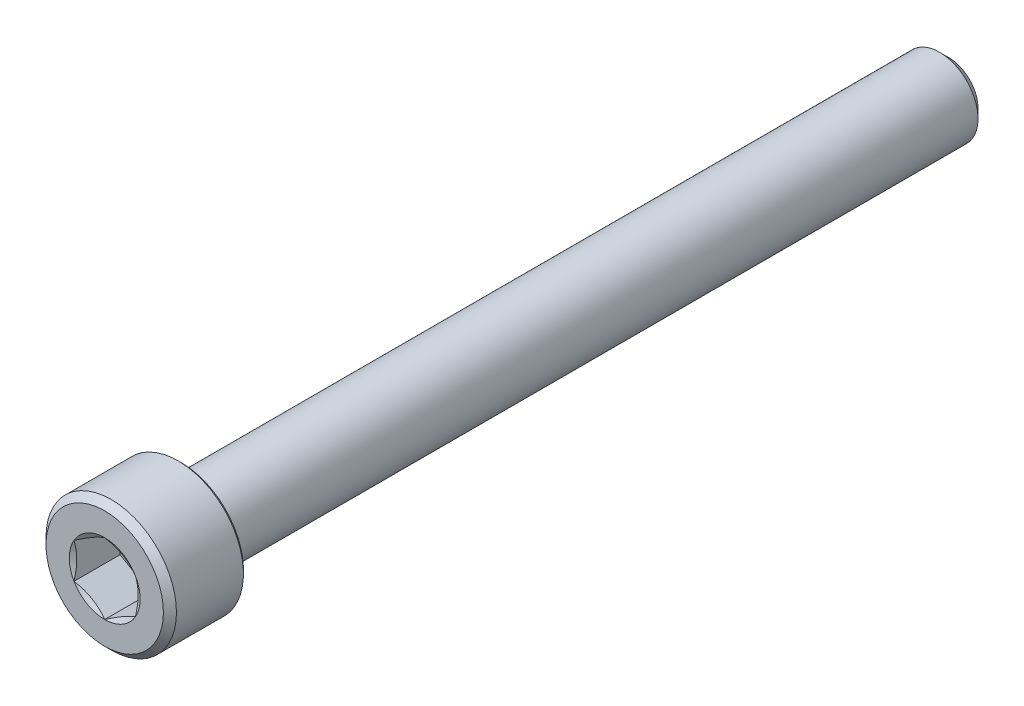
ISO-10303-21;
HEADER;
FILE_DESCRIPTION(('STEP AP214'),'2;1');
FILE_NAME('part.step','',(''),(''),'','','');
FILE_SCHEMA(('AUTOMOTIVE_DESIGN { 1 0 10303 214 1 1 1 1 }'));
ENDSEC;
DATA;
#1=APPLICATION_CONTEXT('core data for automotive mechanical design processes');
#2=APPLICATION_PROTOCOL_DEFINITION('international standard','automotive_design',2000,#1);
#3=PRODUCT_CONTEXT('',#1,'mechanical');
#4=PRODUCT('Part','Part','',(#3));
#5=PRODUCT_RELATED_PRODUCT_CATEGORY('part','',(#4));
#6=PRODUCT_DEFINITION_FORMATION('','',#4);
#7=PRODUCT_DEFINITION_CONTEXT('part definition',#1,'design');
#8=PRODUCT_DEFINITION('design','',#6,#7);
#9=PRODUCT_DEFINITION_SHAPE('','',#8);
#10=(LENGTH_UNIT() NAMED_UNIT(*) SI_UNIT(.MILLI.,.METRE.));
#11=(NAMED_UNIT(*) PLANE_ANGLE_UNIT() SI_UNIT($,.RADIAN.));
#12=(NAMED_UNIT(*) SI_UNIT($,.STERADIAN.) SOLID_ANGLE_UNIT());
#13=UNCERTAINTY_MEASURE_WITH_UNIT(LENGTH_MEASURE(1.E-05),#10,'distance_accuracy_value','');
#14=(GEOMETRIC_REPRESENTATION_CONTEXT(3) GLOBAL_UNCERTAINTY_ASSIGNED_CONTEXT((#13)) GLOBAL_UNIT_ASSIGNED_CONTEXT((#10,
#11,#12)) REPRESENTATION_CONTEXT('',''));
#15=CARTESIAN_POINT('',(0.,0.,0.));
#16=DIRECTION('',(0.,0.,1.));
#17=DIRECTION('',(1.,0.,0.));
#18=AXIS2_PLACEMENT_3D('',#15,#16,#17);
#19=CARTESIAN_POINT('',(-4.03749999999999,0.,22.5));
#20=DIRECTION('',(0.,0.,-1.));
#21=DIRECTION('',(-1.,0.,0.));
#22=AXIS2_PLACEMENT_3D('',#19,#20,#21);
#23=PLANE('',#22);
#24=CARTESIAN_POINT('',(0.,0.,22.5));
#25=DIRECTION('',(0.,0.,-1.));
#26=DIRECTION('',(-1.,0.,0.));
#27=AXIS2_PLACEMENT_3D('',#24,#25,#26);
#28=CIRCLE('',#27,2.5);
#29=CARTESIAN_POINT('',(-2.5,0.,22.5));
#30=VERTEX_POINT('',#29);
#31=EDGE_CURVE('E12',#30,#30,#28,.T.);
#32=ORIENTED_EDGE('',*,*,#31,.F.);
#33=EDGE_LOOP('',(#32));
#34=FACE_BOUND('',#33,.T.);
#35=CARTESIAN_POINT('',(0.,0.,22.5));
#36=DIRECTION('',(0.,0.,-1.));
#37=DIRECTION('',(-1.,0.,0.));
#38=AXIS2_PLACEMENT_3D('',#35,#36,#37);
#39=CIRCLE('',#38,4.03749999999999);
#40=CARTESIAN_POINT('',(-4.03749999999999,0.,22.5));
#41=VERTEX_POINT('',#40);
#42=EDGE_CURVE('E260',#41,#41,#39,.T.);
#43=ORIENTED_EDGE('',*,*,#42,.T.);
#44=EDGE_LOOP('',(#43));
#45=FACE_BOUND('',#44,.T.);
#46=ADVANCED_FACE('F42',(#34,#45),#23,.T.);
#47=CARTESIAN_POINT('',(0.,0.,24.5));
#48=DIRECTION('',(0.,0.,1.));
#49=DIRECTION('',(1.,0.,0.));
#50=AXIS2_PLACEMENT_3D('',#47,#48,#49);
#51=PLANE('',#50);
#52=DIRECTION('',(-0.866025403784439,0.5,0.));
#53=VECTOR('',#52,1.);
#54=CARTESIAN_POINT('',(2.,1.15470053837925,24.5));
#55=LINE('',#54,#53);
#56=CARTESIAN_POINT('',(2.,1.15470053837925,24.5));
#57=VERTEX_POINT('',#56);
#58=CARTESIAN_POINT('',(0.,2.3094010767585,24.5));
#59=VERTEX_POINT('',#58);
#60=EDGE_CURVE('E108',#57,#59,#55,.T.);
#61=ORIENTED_EDGE('',*,*,#60,.T.);
#62=DIRECTION('',(-0.866025403784438,-0.5,0.));
#63=VECTOR('',#62,1.);
#64=CARTESIAN_POINT('',(0.,2.3094010767585,24.5));
#65=LINE('',#64,#63);
#66=CARTESIAN_POINT('',(-2.,1.15470053837925,24.5));
#67=VERTEX_POINT('',#66);
#68=EDGE_CURVE('E227',#59,#67,#65,.T.);
#69=ORIENTED_EDGE('',*,*,#68,.T.);
#70=DIRECTION('',(0.,-1.,0.));
#71=VECTOR('',#70,1.);
#72=CARTESIAN_POINT('',(-2.,1.15470053837925,24.5));
#73=LINE('',#72,#71);
#74=CARTESIAN_POINT('',(-2.,-1.15470053837925,24.5));
#75=VERTEX_POINT('',#74);
#76=EDGE_CURVE('E230',#67,#75,#73,.T.);
#77=ORIENTED_EDGE('',*,*,#76,.T.);
#78=DIRECTION('',(0.866025403784439,-0.5,0.));
#79=VECTOR('',#78,1.);
#80=CARTESIAN_POINT('',(-2.,-1.15470053837925,24.5));
#81=LINE('',#80,#79);
#82=CARTESIAN_POINT('',(0.,-2.3094010767585,24.5));
#83=VERTEX_POINT('',#82);
#84=EDGE_CURVE('E231',#75,#83,#81,.T.);
#85=ORIENTED_EDGE('',*,*,#84,.T.);
#86=DIRECTION('',(0.866025403784439,0.5,0.));
#87=VECTOR('',#86,1.);
#88=CARTESIAN_POINT('',(0.,-2.3094010767585,24.5));
#89=LINE('',#88,#87);
#90=CARTESIAN_POINT('',(2.,-1.15470053837925,24.5));
#91=VERTEX_POINT('',#90);
#92=EDGE_CURVE('E236',#83,#91,#89,.T.);
#93=ORIENTED_EDGE('',*,*,#92,.T.);
#94=DIRECTION('',(0.,1.,0.));
#95=VECTOR('',#94,1.);
#96=CARTESIAN_POINT('',(2.,-1.15470053837925,24.5));
#97=LINE('',#96,#95);
#98=EDGE_CURVE('E229',#91,#57,#97,.T.);
#99=ORIENTED_EDGE('',*,*,#98,.T.);
#100=EDGE_LOOP('',(#61,#69,#77,#85,#93,#99));
#101=FACE_BOUND('',#100,.T.);
#102=ADVANCED_FACE('F216',(#101),#51,.T.);
#103=CARTESIAN_POINT('',(0.,2.3094010767585,24.5));
#104=DIRECTION('',(-0.5,0.866025403784439,0.));
#105=DIRECTION('',(-0.866025403784439,-0.5,0.));
#106=AXIS2_PLACEMENT_3D('',#103,#104,#105);
#107=PLANE('',#106);
#108=DIRECTION('',(0.,0.,1.));
#109=VECTOR('',#108,1.);
#110=CARTESIAN_POINT('',(0.,2.3094010767585,24.5));
#111=LINE('',#110,#109);
#112=CARTESIAN_POINT('',(0.,2.3094010767585,27.5));
#113=VERTEX_POINT('',#112);
#114=EDGE_CURVE('E64',#59,#113,#111,.T.);
#115=ORIENTED_EDGE('',*,*,#114,.T.);
#116=CARTESIAN_POINT('',(0.000199999999999582,2.30951654681234,27.5000666716664));
#117=CARTESIAN_POINT('',(-0.0876912629000604,2.25877250251757,27.4707567411466));
#118=CARTESIAN_POINT('',(-0.176341194473592,2.20759044065995,27.4441000570264));
#119=CARTESIAN_POINT('',(-0.355176246997803,2.10433997494456,27.3975696960666));
#120=CARTESIAN_POINT('',(-0.445364546505037,2.0522697359463,27.3777124814287));
#121=CARTESIAN_POINT('',(-0.624623385763307,1.94877459684592,27.3468006690692));
#122=CARTESIAN_POINT('',(-0.713666338226305,1.89736562427197,27.3355403566444));
#123=CARTESIAN_POINT('',(-0.892171397785044,1.79430568008402,27.3220958676406));
#124=CARTESIAN_POINT('',(-0.981632855703959,1.74265508327244,27.3199005599994));
#125=CARTESIAN_POINT('',(-1.1488083535488,1.64613626458981,27.3244581943766));
#126=CARTESIAN_POINT('',(-1.22654737026578,1.60125362236172,27.3300920797329));
#127=CARTESIAN_POINT('',(-1.38151891453613,1.51178075956051,27.3479511003067));
#128=CARTESIAN_POINT('',(-1.4587509057412,1.46719084864821,27.3601823410694));
#129=CARTESIAN_POINT('',(-1.6140421864822,1.37753338590959,27.3907606419135));
#130=CARTESIAN_POINT('',(-1.69208181310738,1.33247718647009,27.4092373721116));
#131=CARTESIAN_POINT('',(-1.84699686569213,1.24303693915875,27.4511727232588));
#132=CARTESIAN_POINT('',(-1.92387427762312,1.1986517446858,27.4746214855382));
#133=CARTESIAN_POINT('',(-2.0002,1.15458506832541,27.5000666716664));
#134=B_SPLINE_CURVE_WITH_KNOTS('',3,(#116,#117,#118,#119,#120,#121,#122,#123,#124,#125,#126,
#127,#128,#129,#130,#131,#132,#133),.UNSPECIFIED.,.F.,.F.,(4,2,2,2,2,2,2,2,4),(0.,
0.31703182469561,0.634825876346564,0.944753967652636,1.25430138000371,1.52387047293094,
1.79368946861028,2.06949491027634,2.34475850821472),.UNSPECIFIED.);
#135=CARTESIAN_POINT('',(-2.,1.15470053837925,27.5));
#136=VERTEX_POINT('',#135);
#137=EDGE_CURVE('E121',#113,#136,#134,.T.);
#138=ORIENTED_EDGE('',*,*,#137,.T.);
#139=DIRECTION('',(0.,0.,1.));
#140=VECTOR('',#139,1.);
#141=CARTESIAN_POINT('',(-2.,1.15470053837925,24.5));
#142=LINE('',#141,#140);
#143=EDGE_CURVE('E245',#67,#136,#142,.T.);
#144=ORIENTED_EDGE('',*,*,#143,.F.);
#145=ORIENTED_EDGE('',*,*,#68,.F.);
#146=EDGE_LOOP('',(#115,#138,#144,#145));
#147=FACE_BOUND('',#146,.T.);
#148=ADVANCED_FACE('F155',(#147),#107,.F.);
#149=CARTESIAN_POINT('',(-2.,1.15470053837925,24.5));
#150=DIRECTION('',(-1.,0.,0.));
#151=DIRECTION('',(0.,-1.,0.));
#152=AXIS2_PLACEMENT_3D('',#149,#150,#151);
#153=PLANE('',#152);
#154=ORIENTED_EDGE('',*,*,#143,.T.);
#155=CARTESIAN_POINT('',(-2.,-2.99029024286746,28.2436705774789));
#156=CARTESIAN_POINT('',(-2.,-2.9039233549122,28.2022350128154));
#157=CARTESIAN_POINT('',(-2.,-2.81734606544375,28.1612298310159));
#158=CARTESIAN_POINT('',(-2.,-2.64365854493735,28.0803243821909));
#159=CARTESIAN_POINT('',(-2.,-2.55654822138744,28.0404243140125));
#160=CARTESIAN_POINT('',(-2.,-2.38118302896117,27.9617503389694));
#161=CARTESIAN_POINT('',(-2.,-2.29292442261223,27.9229847316336));
#162=CARTESIAN_POINT('',(-2.,-2.11566660170982,27.8471918635543));
#163=CARTESIAN_POINT('',(-2.,-2.02666742594867,27.8101645124244));
#164=CARTESIAN_POINT('',(-2.,-1.84544249851511,27.7373681681925));
#165=CARTESIAN_POINT('',(-2.,-1.75319322532995,27.701657387434));
#166=CARTESIAN_POINT('',(-2.,-1.56757885700113,27.6332048464352));
#167=CARTESIAN_POINT('',(-2.,-1.4742136338563,27.6004634305571));
#168=CARTESIAN_POINT('',(-2.,-1.28643446361951,27.5388859327172));
#169=CARTESIAN_POINT('',(-2.,-1.19202351048257,27.5100408191443));
#170=CARTESIAN_POINT('',(-2.,-1.00184859453872,27.4572423245237));
#171=CARTESIAN_POINT('',(-2.,-0.906084974095545,27.4332877285792));
#172=CARTESIAN_POINT('',(-2.,-0.713403981060255,27.3915474538638));
#173=CARTESIAN_POINT('',(-2.,-0.616489407871837,27.3737491049484));
#174=CARTESIAN_POINT('',(-2.,-0.421576659767191,27.3454859555612));
#175=CARTESIAN_POINT('',(-2.,-0.323578558532563,27.3350206595082));
#176=CARTESIAN_POINT('',(-2.,-0.128212412243735,27.3223976828881));
#177=CARTESIAN_POINT('',(-2.,-0.0308508865278538,27.3201419664817));
#178=CARTESIAN_POINT('',(-2.,0.163710907351544,27.3238660001585));
#179=CARTESIAN_POINT('',(-2.,0.26091116515686,27.3298462601828));
#180=CARTESIAN_POINT('',(-2.,0.500738496705999,27.3542367986828));
#181=CARTESIAN_POINT('',(-2.,0.642900874941925,27.3772179857328));
#182=CARTESIAN_POINT('',(-2.,0.924461055762403,27.4364797724985));
#183=CARTESIAN_POINT('',(-2.,1.06385531203148,27.4727764011974));
#184=CARTESIAN_POINT('',(-2.,1.27233476439731,27.5347799260889));
#185=CARTESIAN_POINT('',(-2.,1.34249760828297,27.5569967132613));
#186=CARTESIAN_POINT('',(-2.,1.48209294499886,27.6034854664852));
#187=CARTESIAN_POINT('',(-2.,1.5515258636265,27.6277561499463));
#188=CARTESIAN_POINT('',(-2.,1.68975413890005,27.6780002153862));
#189=CARTESIAN_POINT('',(-2.,1.75854960883308,27.7039732879257));
#190=CARTESIAN_POINT('',(-2.,1.89559846372949,27.7573411907401));
#191=CARTESIAN_POINT('',(-2.,1.96385175484502,27.7847362612267));
#192=CARTESIAN_POINT('',(-2.,2.1380709928287,27.8564181386155));
#193=CARTESIAN_POINT('',(-2.,2.24368858156614,27.9015507076219));
#194=CARTESIAN_POINT('',(-2.,2.45396999511266,27.9939914959885));
#195=CARTESIAN_POINT('',(-2.,2.55863374776564,28.0412998783351));
#196=CARTESIAN_POINT('',(-2.,2.87151206778262,28.1857217451608));
#197=CARTESIAN_POINT('',(-2.,3.0785787487255,28.2853171433883));
#198=CARTESIAN_POINT('',(-2.,3.49094307145926,28.4886849551519));
#199=CARTESIAN_POINT('',(-2.,3.69623822556834,28.5924623531372));
#200=CARTESIAN_POINT('',(-2.,4.10542196763743,28.8026856010433));
#201=CARTESIAN_POINT('',(-2.,4.30931073022524,28.9091311117793));
#202=CARTESIAN_POINT('',(-2.,4.69691639401989,29.113726514207));
#203=CARTESIAN_POINT('',(-2.,4.88072085209385,29.2117111050986));
#204=CARTESIAN_POINT('',(-2.,5.2477385233816,29.4087967213488));
#205=CARTESIAN_POINT('',(-2.,5.43095171439014,29.5078977880236));
#206=CARTESIAN_POINT('',(-2.,5.79645714315415,29.7066832443465));
#207=CARTESIAN_POINT('',(-2.,5.97875053807596,29.8063655091631));
#208=CARTESIAN_POINT('',(-2.,6.34296877430456,30.0063788260171));
#209=CARTESIAN_POINT('',(-2.,6.52489363439936,30.1067098438291));
#210=CARTESIAN_POINT('',(-2.,6.70668608827319,30.2072787608358));
#211=B_SPLINE_CURVE_WITH_KNOTS('',3,(#155,#156,#157,#158,#159,#160,#161,#162,#163,#164,#165,
#166,#167,#168,#169,#170,#171,#172,#173,#174,#175,#176,#177,#178,#179,#180,#181,#182,#183,#184,
#185,#186,#187,#188,#189,#190,#191,#192,#193,#194,#195,#196,#197,#198,#199,#200,#201,#202,#203,
#204,#205,#206,#207,#208,#209,#210),.UNSPECIFIED.,.F.,.F.,(4,2,2,2,2,2,2,2,2,2,2,2,2,2,2,2,2,2,
2,2,2,2,2,2,2,2,2,4),(0.,0.287380681388115,0.574812740623682,0.863988372930488,1.15314895189072,
1.4498698259759,1.74662506739396,2.04268017375204,2.33866164470185,2.63403028141922,
2.92937895465126,3.22118888927989,3.51301689251078,3.94415417741651,4.37581217290736,
4.59657665342085,4.81720427698904,5.03779190819845,5.25841692430919,5.60295100374334,
5.94751093378603,6.63674459882492,7.32682556520813,8.01681924533216,8.6416872890753,
9.26657853306545,9.88988035134099,10.5131495508289),.UNSPECIFIED.);
#212=CARTESIAN_POINT('',(-2.,-1.15470053837926,27.5));
#213=VERTEX_POINT('',#212);
#214=EDGE_CURVE('E128',#136,#213,#211,.F.);
#215=ORIENTED_EDGE('',*,*,#214,.T.);
#216=DIRECTION('',(0.,0.,1.));
#217=VECTOR('',#216,1.);
#218=CARTESIAN_POINT('',(-2.,-1.15470053837925,24.5));
#219=LINE('',#218,#217);
#220=EDGE_CURVE('E243',#75,#213,#219,.T.);
#221=ORIENTED_EDGE('',*,*,#220,.F.);
#222=ORIENTED_EDGE('',*,*,#76,.F.);
#223=EDGE_LOOP('',(#154,#215,#221,#222));
#224=FACE_BOUND('',#223,.T.);
#225=ADVANCED_FACE('F150',(#224),#153,.F.);
#226=CARTESIAN_POINT('',(-2.,-1.15470053837925,24.5));
#227=DIRECTION('',(-0.5,-0.866025403784439,0.));
#228=DIRECTION('',(0.866025403784439,-0.5,0.));
#229=AXIS2_PLACEMENT_3D('',#226,#227,#228);
#230=PLANE('',#229);
#231=ORIENTED_EDGE('',*,*,#220,.T.);
#232=CARTESIAN_POINT('',(-2.0002,-1.15458506832541,27.5000666716664));
#233=CARTESIAN_POINT('',(-1.91230873709994,-1.20532911262018,27.4707567411466));
#234=CARTESIAN_POINT('',(-1.82365880552641,-1.2565111744778,27.4441000570264));
#235=CARTESIAN_POINT('',(-1.6448237530022,-1.35976164019319,27.3975696960666));
#236=CARTESIAN_POINT('',(-1.55463545349496,-1.41183187919145,27.3777124814287));
#237=CARTESIAN_POINT('',(-1.37537661423669,-1.51532701829183,27.3468006690692));
#238=CARTESIAN_POINT('',(-1.2863336617737,-1.56673599086578,27.3355403566444));
#239=CARTESIAN_POINT('',(-1.10782860221496,-1.66979593505373,27.3220958676406));
#240=CARTESIAN_POINT('',(-1.01836714429604,-1.72144653186531,27.3199005599994));
#241=CARTESIAN_POINT('',(-0.851191646451201,-1.81796535054794,27.3244581943766));
#242=CARTESIAN_POINT('',(-0.773452629734216,-1.86284799277603,27.3300920797329));
#243=CARTESIAN_POINT('',(-0.618481085463866,-1.95232085557725,27.3479511003067));
#244=CARTESIAN_POINT('',(-0.541249094258801,-1.99691076648954,27.3601823410694));
#245=CARTESIAN_POINT('',(-0.385957813517799,-2.08656822922816,27.3907606419135));
#246=CARTESIAN_POINT('',(-0.30791818689262,-2.13162442866767,27.4092373721116));
#247=CARTESIAN_POINT('',(-0.153003134307865,-2.221064675979,27.4511727232588));
#248=CARTESIAN_POINT('',(-0.0761257223768798,-2.26544987045196,27.4746214855382));
#249=CARTESIAN_POINT('',(0.000200000000000351,-2.30951654681234,27.5000666716664));
#250=B_SPLINE_CURVE_WITH_KNOTS('',3,(#232,#233,#234,#235,#236,#237,#238,#239,#240,#241,#242,
#243,#244,#245,#246,#247,#248,#249),.UNSPECIFIED.,.F.,.F.,(4,2,2,2,2,2,2,2,4),(0.,
0.31703182469561,0.634825876346564,0.944753967652636,1.25430138000371,1.52387047293094,
1.79368946861028,2.06949491027634,2.34475850821472),.UNSPECIFIED.);
#251=CARTESIAN_POINT('',(0.,-2.30940107675851,27.5));
#252=VERTEX_POINT('',#251);
#253=EDGE_CURVE('E131',#213,#252,#250,.T.);
#254=ORIENTED_EDGE('',*,*,#253,.T.);
#255=DIRECTION('',(0.,0.,1.));
#256=VECTOR('',#255,1.);
#257=CARTESIAN_POINT('',(0.,-2.3094010767585,24.5));
#258=LINE('',#257,#256);
#259=EDGE_CURVE('E240',#83,#252,#258,.T.);
#260=ORIENTED_EDGE('',*,*,#259,.F.);
#261=ORIENTED_EDGE('',*,*,#84,.F.);
#262=EDGE_LOOP('',(#231,#254,#260,#261));
#263=FACE_BOUND('',#262,.T.);
#264=ADVANCED_FACE('F154',(#263),#230,.F.);
#265=CARTESIAN_POINT('',(0.,-2.3094010767585,24.5));
#266=DIRECTION('',(0.5,-0.866025403784438,0.));
#267=DIRECTION('',(0.866025403784439,0.5,0.));
#268=AXIS2_PLACEMENT_3D('',#265,#266,#267);
#269=PLANE('',#268);
#270=ORIENTED_EDGE('',*,*,#259,.T.);
#271=CARTESIAN_POINT('',(-0.000199999999999377,-2.30951654681234,27.5000666716664));
#272=CARTESIAN_POINT('',(0.0876912629000602,-2.25877250251758,27.4707567411466));
#273=CARTESIAN_POINT('',(0.176341194473591,-2.20759044065996,27.4441000570264));
#274=CARTESIAN_POINT('',(0.355176246997802,-2.10433997494456,27.3975696960666));
#275=CARTESIAN_POINT('',(0.445364546505037,-2.05226973594631,27.3777124814287));
#276=CARTESIAN_POINT('',(0.624623385763306,-1.94877459684592,27.3468006690692));
#277=CARTESIAN_POINT('',(0.713666338226304,-1.89736562427197,27.3355403566444));
#278=CARTESIAN_POINT('',(0.892171397785043,-1.79430568008402,27.3220958676406));
#279=CARTESIAN_POINT('',(0.981632855703958,-1.74265508327244,27.3199005599994));
#280=CARTESIAN_POINT('',(1.1488083535488,-1.64613626458981,27.3244581943766));
#281=CARTESIAN_POINT('',(1.22654737026578,-1.60125362236173,27.3300920797329));
#282=CARTESIAN_POINT('',(1.38151891453613,-1.51178075956051,27.3479511003067));
#283=CARTESIAN_POINT('',(1.4587509057412,-1.46719084864821,27.3601823410694));
#284=CARTESIAN_POINT('',(1.6140421864822,-1.37753338590959,27.3907606419135));
#285=CARTESIAN_POINT('',(1.69208181310738,-1.33247718647009,27.4092373721116));
#286=CARTESIAN_POINT('',(1.84699686569214,-1.24303693915875,27.4511727232588));
#287=CARTESIAN_POINT('',(1.92387427762312,-1.1986517446858,27.4746214855382));
#288=CARTESIAN_POINT('',(2.0002,-1.15458506832541,27.5000666716664));
#289=B_SPLINE_CURVE_WITH_KNOTS('',3,(#271,#272,#273,#274,#275,#276,#277,#278,#279,#280,#281,
#282,#283,#284,#285,#286,#287,#288),.UNSPECIFIED.,.F.,.F.,(4,2,2,2,2,2,2,2,4),(0.,
0.317031824695609,0.634825876346563,0.944753967652635,1.25430138000371,1.52387047293094,
1.79368946861028,2.06949491027634,2.34475850821472),.UNSPECIFIED.);
#290=CARTESIAN_POINT('',(2.,-1.15470053837925,27.5));
#291=VERTEX_POINT('',#290);
#292=EDGE_CURVE('E116',#252,#291,#289,.T.);
#293=ORIENTED_EDGE('',*,*,#292,.T.);
#294=DIRECTION('',(0.,0.,1.));
#295=VECTOR('',#294,1.);
#296=CARTESIAN_POINT('',(2.,-1.15470053837925,24.5));
#297=LINE('',#296,#295);
#298=EDGE_CURVE('E114',#91,#291,#297,.T.);
#299=ORIENTED_EDGE('',*,*,#298,.F.);
#300=ORIENTED_EDGE('',*,*,#92,.F.);
#301=EDGE_LOOP('',(#270,#293,#299,#300));
#302=FACE_BOUND('',#301,.T.);
#303=ADVANCED_FACE('F161',(#302),#269,.F.);
#304=CARTESIAN_POINT('',(2.,-1.15470053837925,24.5));
#305=DIRECTION('',(1.,0.,0.));
#306=DIRECTION('',(0.,0.,-1.));
#307=AXIS2_PLACEMENT_3D('',#304,#305,#306);
#308=PLANE('',#307);
#309=ORIENTED_EDGE('',*,*,#298,.T.);
#310=CARTESIAN_POINT('',(2.,-2.99029024286747,28.2436705774789));
#311=CARTESIAN_POINT('',(2.,-2.9039233549122,28.2022350128154));
#312=CARTESIAN_POINT('',(2.,-2.81734606544375,28.1612298310159));
#313=CARTESIAN_POINT('',(2.,-2.64365854493735,28.0803243821909));
#314=CARTESIAN_POINT('',(2.,-2.55654822138744,28.0404243140125));
#315=CARTESIAN_POINT('',(2.,-2.38118302896117,27.9617503389694));
#316=CARTESIAN_POINT('',(2.,-2.29292442261223,27.9229847316336));
#317=CARTESIAN_POINT('',(2.,-2.11566660170982,27.8471918635543));
#318=CARTESIAN_POINT('',(2.,-2.02666742594867,27.8101645124244));
#319=CARTESIAN_POINT('',(2.,-1.84544249851511,27.7373681681925));
#320=CARTESIAN_POINT('',(2.,-1.75319322532995,27.701657387434));
#321=CARTESIAN_POINT('',(2.,-1.56757885700113,27.6332048464352));
#322=CARTESIAN_POINT('',(2.,-1.4742136338563,27.6004634305571));
#323=CARTESIAN_POINT('',(2.,-1.28643446361951,27.5388859327172));
#324=CARTESIAN_POINT('',(2.,-1.19202351048257,27.5100408191443));
#325=CARTESIAN_POINT('',(2.,-1.00184859453872,27.4572423245237));
#326=CARTESIAN_POINT('',(2.,-0.906084974095544,27.4332877285792));
#327=CARTESIAN_POINT('',(2.,-0.713403981060255,27.3915474538638));
#328=CARTESIAN_POINT('',(2.,-0.616489407871837,27.3737491049484));
#329=CARTESIAN_POINT('',(2.,-0.421576659767191,27.3454859555612));
#330=CARTESIAN_POINT('',(2.,-0.323578558532563,27.3350206595082));
#331=CARTESIAN_POINT('',(2.,-0.128212412243735,27.3223976828881));
#332=CARTESIAN_POINT('',(2.,-0.0308508865278541,27.3201419664817));
#333=CARTESIAN_POINT('',(2.,0.163710907351543,27.3238660001585));
#334=CARTESIAN_POINT('',(2.,0.26091116515686,27.3298462601828));
#335=CARTESIAN_POINT('',(2.,0.500738496705998,27.3542367986828));
#336=CARTESIAN_POINT('',(2.,0.642900874941925,27.3772179857328));
#337=CARTESIAN_POINT('',(2.,0.924461055762403,27.4364797724985));
#338=CARTESIAN_POINT('',(2.,1.06385531203148,27.4727764011974));
#339=CARTESIAN_POINT('',(2.,1.27233476439731,27.5347799260889));
#340=CARTESIAN_POINT('',(2.,1.34249760828297,27.5569967132613));
#341=CARTESIAN_POINT('',(2.,1.48209294499886,27.6034854664852));
#342=CARTESIAN_POINT('',(2.,1.5515258636265,27.6277561499463));
#343=CARTESIAN_POINT('',(2.,1.68975413890004,27.6780002153862));
#344=CARTESIAN_POINT('',(2.,1.75854960883307,27.7039732879257));
#345=CARTESIAN_POINT('',(2.,1.89559846372949,27.7573411907401));
#346=CARTESIAN_POINT('',(2.,1.96385175484502,27.7847362612267));
#347=CARTESIAN_POINT('',(2.,2.1380709928287,27.8564181386155));
#348=CARTESIAN_POINT('',(2.,2.24368858156614,27.9015507076219));
#349=CARTESIAN_POINT('',(2.,2.45396999511266,27.9939914959885));
#350=CARTESIAN_POINT('',(2.,2.55863374776564,28.0412998783351));
#351=CARTESIAN_POINT('',(2.,2.87151206778262,28.1857217451608));
#352=CARTESIAN_POINT('',(2.,3.0785787487255,28.2853171433883));
#353=CARTESIAN_POINT('',(2.,3.49094307145926,28.4886849551519));
#354=CARTESIAN_POINT('',(2.,3.69623822556834,28.5924623531372));
#355=CARTESIAN_POINT('',(2.,4.10542196763743,28.8026856010433));
#356=CARTESIAN_POINT('',(2.,4.30931073022524,28.9091311117793));
#357=CARTESIAN_POINT('',(2.,4.69691639401988,29.113726514207));
#358=CARTESIAN_POINT('',(2.,4.88072085209385,29.2117111050986));
#359=CARTESIAN_POINT('',(2.,5.2477385233816,29.4087967213488));
#360=CARTESIAN_POINT('',(2.,5.43095171439014,29.5078977880236));
#361=CARTESIAN_POINT('',(2.,5.79645714315415,29.7066832443465));
#362=CARTESIAN_POINT('',(2.,5.97875053807595,29.8063655091631));
#363=CARTESIAN_POINT('',(2.,6.34296877430456,30.0063788260171));
#364=CARTESIAN_POINT('',(2.,6.52489363439936,30.1067098438291));
#365=CARTESIAN_POINT('',(2.,6.70668608827319,30.2072787608358));
#366=B_SPLINE_CURVE_WITH_KNOTS('',3,(#310,#311,#312,#313,#314,#315,#316,#317,#318,#319,#320,
#321,#322,#323,#324,#325,#326,#327,#328,#329,#330,#331,#332,#333,#334,#335,#336,#337,#338,#339,
#340,#341,#342,#343,#344,#345,#346,#347,#348,#349,#350,#351,#352,#353,#354,#355,#356,#357,#358,
#359,#360,#361,#362,#363,#364,#365),.UNSPECIFIED.,.F.,.F.,(4,2,2,2,2,2,2,2,2,2,2,2,2,2,2,2,2,2,
2,2,2,2,2,2,2,2,2,4),(0.,0.287380681388116,0.574812740623684,0.863988372930489,1.15314895189072,
1.4498698259759,1.74662506739396,2.04268017375205,2.33866164470185,2.63403028141922,
2.92937895465126,3.2211888892799,3.51301689251078,3.94415417741651,4.37581217290736,
4.59657665342085,4.81720427698905,5.03779190819845,5.25841692430919,5.60295100374335,
5.94751093378604,6.63674459882492,7.32682556520813,8.01681924533216,8.64168728907531,
9.26657853306545,9.88988035134099,10.5131495508289),.UNSPECIFIED.);
#367=CARTESIAN_POINT('',(2.,1.15470053837925,27.5));
#368=VERTEX_POINT('',#367);
#369=EDGE_CURVE('E100',#291,#368,#366,.T.);
#370=ORIENTED_EDGE('',*,*,#369,.T.);
#371=DIRECTION('',(0.,0.,1.));
#372=VECTOR('',#371,1.);
#373=CARTESIAN_POINT('',(2.,1.15470053837925,24.5));
#374=LINE('',#373,#372);
#375=EDGE_CURVE('E113',#57,#368,#374,.T.);
#376=ORIENTED_EDGE('',*,*,#375,.F.);
#377=ORIENTED_EDGE('',*,*,#98,.F.);
#378=EDGE_LOOP('',(#309,#370,#376,#377));
#379=FACE_BOUND('',#378,.T.);
#380=ADVANCED_FACE('F111',(#379),#308,.F.);
#381=CARTESIAN_POINT('',(2.,1.15470053837925,24.5));
#382=DIRECTION('',(0.5,0.866025403784439,0.));
#383=DIRECTION('',(-0.866025403784439,0.5,0.));
#384=AXIS2_PLACEMENT_3D('',#381,#382,#383);
#385=PLANE('',#384);
#386=ORIENTED_EDGE('',*,*,#375,.T.);
#387=CARTESIAN_POINT('',(2.0002,1.15458506832541,27.5000666716664));
#388=CARTESIAN_POINT('',(1.91230873709994,1.20532911262018,27.4707567411466));
#389=CARTESIAN_POINT('',(1.82365880552641,1.2565111744778,27.4441000570264));
#390=CARTESIAN_POINT('',(1.6448237530022,1.35976164019319,27.3975696960666));
#391=CARTESIAN_POINT('',(1.55463545349496,1.41183187919145,27.3777124814287));
#392=CARTESIAN_POINT('',(1.37537661423669,1.51532701829183,27.3468006690692));
#393=CARTESIAN_POINT('',(1.2863336617737,1.56673599086578,27.3355403566444));
#394=CARTESIAN_POINT('',(1.10782860221496,1.66979593505373,27.3220958676406));
#395=CARTESIAN_POINT('',(1.01836714429604,1.72144653186531,27.3199005599994));
#396=CARTESIAN_POINT('',(0.851191646451202,1.81796535054794,27.3244581943766));
#397=CARTESIAN_POINT('',(0.773452629734216,1.86284799277603,27.3300920797329));
#398=CARTESIAN_POINT('',(0.618481085463867,1.95232085557725,27.3479511003067));
#399=CARTESIAN_POINT('',(0.541249094258802,1.99691076648954,27.3601823410694));
#400=CARTESIAN_POINT('',(0.385957813517799,2.08656822922816,27.3907606419135));
#401=CARTESIAN_POINT('',(0.307918186892621,2.13162442866767,27.4092373721116));
#402=CARTESIAN_POINT('',(0.153003134307866,2.221064675979,27.4511727232588));
#403=CARTESIAN_POINT('',(0.0761257223768801,2.26544987045196,27.4746214855382));
#404=CARTESIAN_POINT('',(-0.000200000000000223,2.30951654681234,27.5000666716664));
#405=B_SPLINE_CURVE_WITH_KNOTS('',3,(#387,#388,#389,#390,#391,#392,#393,#394,#395,#396,#397,
#398,#399,#400,#401,#402,#403,#404),.UNSPECIFIED.,.F.,.F.,(4,2,2,2,2,2,2,2,4),(0.,
0.317031824695609,0.634825876346563,0.944753967652636,1.25430138000371,1.52387047293094,
1.79368946861028,2.06949491027634,2.34475850821472),.UNSPECIFIED.);
#406=EDGE_CURVE('E105',#368,#113,#405,.T.);
#407=ORIENTED_EDGE('',*,*,#406,.T.);
#408=ORIENTED_EDGE('',*,*,#114,.F.);
#409=ORIENTED_EDGE('',*,*,#60,.F.);
#410=EDGE_LOOP('',(#386,#407,#408,#409));
#411=FACE_BOUND('',#410,.T.);
#412=ADVANCED_FACE('F118',(#411),#385,.F.);
#413=CARTESIAN_POINT('',(0.,0.,27.5));
#414=DIRECTION('',(0.,0.,1.));
#415=DIRECTION('',(1.,0.,0.));
#416=AXIS2_PLACEMENT_3D('',#413,#414,#415);
#417=CONICAL_SURFACE('',#416,2.3094010767585,1.0471975511966);
#418=CARTESIAN_POINT('',(0.,0.,27.5));
#419=DIRECTION('',(0.,0.,1.));
#420=DIRECTION('',(1.,0.,0.));
#421=AXIS2_PLACEMENT_3D('',#418,#419,#420);
#422=CIRCLE('',#421,2.3094010767585);
#423=EDGE_CURVE('E127',#113,#136,#422,.T.);
#424=ORIENTED_EDGE('',*,*,#423,.T.);
#425=ORIENTED_EDGE('',*,*,#137,.F.);
#426=EDGE_LOOP('',(#424,#425));
#427=FACE_BOUND('',#426,.T.);
#428=ADVANCED_FACE('F185',(#427),#417,.F.);
#429=EDGE_CURVE('E129',#136,#213,#422,.T.);
#430=ORIENTED_EDGE('',*,*,#429,.T.);
#431=ORIENTED_EDGE('',*,*,#214,.F.);
#432=EDGE_LOOP('',(#430,#431));
#433=FACE_BOUND('',#432,.T.);
#434=ADVANCED_FACE('F296',(#433),#417,.F.);
#435=EDGE_CURVE('E285',#213,#252,#422,.T.);
#436=ORIENTED_EDGE('',*,*,#435,.T.);
#437=ORIENTED_EDGE('',*,*,#253,.F.);
#438=EDGE_LOOP('',(#436,#437));
#439=FACE_BOUND('',#438,.T.);
#440=ADVANCED_FACE('F294',(#439),#417,.F.);
#441=EDGE_CURVE('E104',#252,#291,#422,.T.);
#442=ORIENTED_EDGE('',*,*,#441,.T.);
#443=ORIENTED_EDGE('',*,*,#292,.F.);
#444=EDGE_LOOP('',(#442,#443));
#445=FACE_BOUND('',#444,.T.);
#446=ADVANCED_FACE('F291',(#445),#417,.F.);
#447=EDGE_CURVE('E50',#291,#368,#422,.T.);
#448=ORIENTED_EDGE('',*,*,#447,.T.);
#449=ORIENTED_EDGE('',*,*,#369,.F.);
#450=EDGE_LOOP('',(#448,#449));
#451=FACE_BOUND('',#450,.T.);
#452=ADVANCED_FACE('F98',(#451),#417,.F.);
#453=EDGE_CURVE('E45',#368,#113,#422,.T.);
#454=ORIENTED_EDGE('',*,*,#453,.T.);
#455=ORIENTED_EDGE('',*,*,#406,.F.);
#456=EDGE_LOOP('',(#454,#455));
#457=FACE_BOUND('',#456,.T.);
#458=ADVANCED_FACE('F106',(#457),#417,.F.);
#459=CARTESIAN_POINT('',(0.,4.24999999999999,27.5));
#460=DIRECTION('',(0.,0.,1.));
#461=DIRECTION('',(1.,0.,0.));
#462=AXIS2_PLACEMENT_3D('',#459,#460,#461);
#463=PLANE('',#462);
#464=CARTESIAN_POINT('',(0.,0.,27.5));
#465=DIRECTION('',(0.,0.,1.));
#466=DIRECTION('',(1.,0.,0.));
#467=AXIS2_PLACEMENT_3D('',#464,#465,#466);
#468=CIRCLE('',#467,3.82499999999999);
#469=CARTESIAN_POINT('',(3.82499999999999,0.,27.5));
#470=VERTEX_POINT('',#469);
#471=EDGE_CURVE('E257',#470,#470,#468,.T.);
#472=ORIENTED_EDGE('',*,*,#471,.T.);
#473=EDGE_LOOP('',(#472));
#474=FACE_BOUND('',#473,.T.);
#475=ORIENTED_EDGE('',*,*,#453,.F.);
#476=ORIENTED_EDGE('',*,*,#447,.F.);
#477=ORIENTED_EDGE('',*,*,#441,.F.);
#478=ORIENTED_EDGE('',*,*,#435,.F.);
#479=ORIENTED_EDGE('',*,*,#429,.F.);
#480=ORIENTED_EDGE('',*,*,#423,.F.);
#481=EDGE_LOOP('',(#475,#476,#477,#478,#479,#480));
#482=FACE_BOUND('',#481,.T.);
#483=ADVANCED_FACE('F124',(#474,#482),#463,.T.);
#484=CARTESIAN_POINT('',(0.,0.,27.075));
#485=DIRECTION('',(0.,0.,-1.));
#486=DIRECTION('',(-1.,0.,0.));
#487=AXIS2_PLACEMENT_3D('',#484,#485,#486);
#488=CONICAL_SURFACE('',#487,4.25,0.785398163397448);
#489=ORIENTED_EDGE('',*,*,#471,.F.);
#490=EDGE_LOOP('',(#489));
#491=FACE_BOUND('',#490,.T.);
#492=CARTESIAN_POINT('',(0.,0.,27.075));
#493=DIRECTION('',(0.,0.,1.));
#494=DIRECTION('',(1.,0.,0.));
#495=AXIS2_PLACEMENT_3D('',#492,#493,#494);
#496=CIRCLE('',#495,4.25);
#497=CARTESIAN_POINT('',(4.25,0.,27.075));
#498=VERTEX_POINT('',#497);
#499=EDGE_CURVE('E254',#498,#498,#496,.F.);
#500=ORIENTED_EDGE('',*,*,#499,.F.);
#501=EDGE_LOOP('',(#500));
#502=FACE_BOUND('',#501,.T.);
#503=ADVANCED_FACE('F190',(#491,#502),#488,.T.);
#504=CARTESIAN_POINT('',(0.,0.,-27.5));
#505=DIRECTION('',(0.,0.,-1.));
#506=DIRECTION('',(-1.,0.,0.));
#507=AXIS2_PLACEMENT_3D('',#504,#505,#506);
#508=CYLINDRICAL_SURFACE('',#507,4.25);
#509=CARTESIAN_POINT('',(0.,0.,22.7125));
#510=DIRECTION('',(0.,0.,-1.));
#511=DIRECTION('',(-1.,0.,0.));
#512=AXIS2_PLACEMENT_3D('',#509,#510,#511);
#513=CIRCLE('',#512,4.25);
#514=CARTESIAN_POINT('',(-4.25,0.,22.7125));
#515=VERTEX_POINT('',#514);
#516=EDGE_CURVE('E263',#515,#515,#513,.F.);
#517=ORIENTED_EDGE('',*,*,#516,.T.);
#518=EDGE_LOOP('',(#517));
#519=FACE_BOUND('',#518,.T.);
#520=ORIENTED_EDGE('',*,*,#499,.T.);
#521=EDGE_LOOP('',(#520));
#522=FACE_BOUND('',#521,.T.);
#523=ADVANCED_FACE('F186',(#519,#522),#508,.T.);
#524=CARTESIAN_POINT('',(0.,0.,22.5));
#525=DIRECTION('',(0.,0.,1.));
#526=DIRECTION('',(1.,0.,0.));
#527=AXIS2_PLACEMENT_3D('',#524,#525,#526);
#528=CONICAL_SURFACE('',#527,4.03749999999999,0.785398163397448);
#529=ORIENTED_EDGE('',*,*,#516,.F.);
#530=EDGE_LOOP('',(#529));
#531=FACE_BOUND('',#530,.T.);
#532=ORIENTED_EDGE('',*,*,#42,.F.);
#533=EDGE_LOOP('',(#532));
#534=FACE_BOUND('',#533,.T.);
#535=ADVANCED_FACE('F189',(#531,#534),#528,.T.);
#536=CARTESIAN_POINT('',(0.,0.,-27.5));
#537=DIRECTION('',(0.,0.,-1.));
#538=DIRECTION('',(-1.,0.,0.));
#539=AXIS2_PLACEMENT_3D('',#536,#537,#538);
#540=CYLINDRICAL_SURFACE('',#539,2.5);
#541=CARTESIAN_POINT('',(0.,0.,-26.9));
#542=DIRECTION('',(0.,0.,-1.));
#543=DIRECTION('',(-1.,0.,0.));
#544=AXIS2_PLACEMENT_3D('',#541,#542,#543);
#545=CIRCLE('',#544,2.5);
#546=CARTESIAN_POINT('',(-2.5,0.,-26.9));
#547=VERTEX_POINT('',#546);
#548=EDGE_CURVE('E269',#547,#547,#545,.T.);
#549=ORIENTED_EDGE('',*,*,#548,.F.);
#550=EDGE_LOOP('',(#549));
#551=FACE_BOUND('',#550,.T.);
#552=ORIENTED_EDGE('',*,*,#31,.T.);
#553=EDGE_LOOP('',(#552));
#554=FACE_BOUND('',#553,.T.);
#555=ADVANCED_FACE('F200',(#551,#554),#540,.T.);
#556=CARTESIAN_POINT('',(0.,0.,-26.9));
#557=DIRECTION('',(0.,0.,1.));
#558=DIRECTION('',(1.,0.,0.));
#559=AXIS2_PLACEMENT_3D('',#556,#557,#558);
#560=CONICAL_SURFACE('',#559,2.5,0.785398163397446);
#561=CARTESIAN_POINT('',(0.,0.,-27.5));
#562=DIRECTION('',(0.,0.,-1.));
#563=DIRECTION('',(-1.,0.,0.));
#564=AXIS2_PLACEMENT_3D('',#561,#562,#563);
#565=CIRCLE('',#564,1.9);
#566=CARTESIAN_POINT('',(-1.9,0.,-27.5));
#567=VERTEX_POINT('',#566);
#568=EDGE_CURVE('E265',#567,#567,#565,.T.);
#569=ORIENTED_EDGE('',*,*,#568,.F.);
#570=EDGE_LOOP('',(#569));
#571=FACE_BOUND('',#570,.T.);
#572=ORIENTED_EDGE('',*,*,#548,.T.);
#573=EDGE_LOOP('',(#572));
#574=FACE_BOUND('',#573,.T.);
#575=ADVANCED_FACE('F204',(#571,#574),#560,.T.);
#576=CARTESIAN_POINT('',(0.,2.49999999999999,-27.5));
#577=DIRECTION('',(0.,0.,-1.));
#578=DIRECTION('',(-1.,0.,0.));
#579=AXIS2_PLACEMENT_3D('',#576,#577,#578);
#580=PLANE('',#579);
#581=ORIENTED_EDGE('',*,*,#568,.T.);
#582=EDGE_LOOP('',(#581));
#583=FACE_BOUND('',#582,.T.);
#584=ADVANCED_FACE('F206',(#583),#580,.T.);
#585=CLOSED_SHELL('',(#46,#102,#148,#225,#264,#303,#380,#412,#428,#434,#440,#446,#452,#458,#483,
#503,#523,#535,#555,#575,#584));
#586=MANIFOLD_SOLID_BREP('B2',#585);
#587=ADVANCED_BREP_SHAPE_REPRESENTATION('',(#18,#586),#14);
#588=SHAPE_DEFINITION_REPRESENTATION(#9,#587);
ENDSEC;
END-ISO-10303-21;
